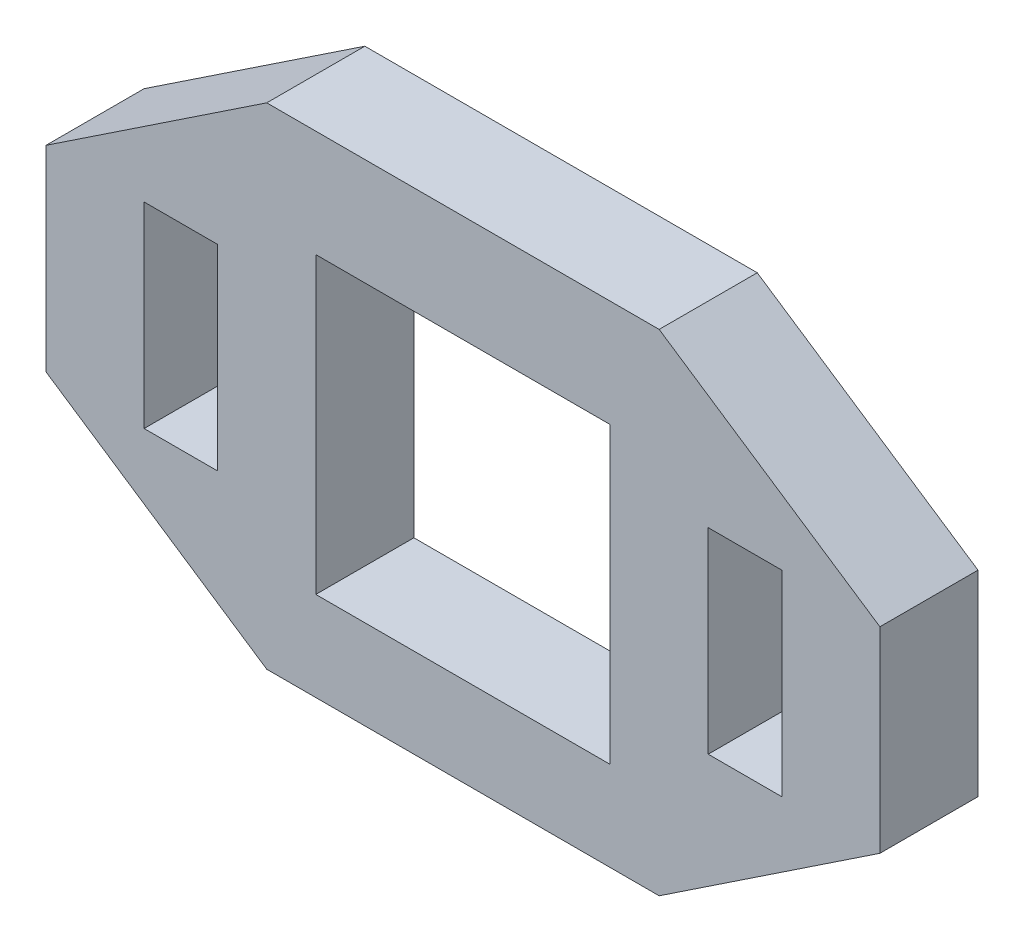
ISO-10303-21;
HEADER;
FILE_DESCRIPTION(('STEP AP214'),'2;1');
FILE_NAME('part.step','',(''),(''),'','','');
FILE_SCHEMA(('AUTOMOTIVE_DESIGN { 1 0 10303 214 1 1 1 1 }'));
ENDSEC;
DATA;
#1=APPLICATION_CONTEXT('core data for automotive mechanical design processes');
#2=APPLICATION_PROTOCOL_DEFINITION('international standard','automotive_design',2000,#1);
#3=PRODUCT_CONTEXT('',#1,'mechanical');
#4=PRODUCT('Part','Part','',(#3));
#5=PRODUCT_RELATED_PRODUCT_CATEGORY('part','',(#4));
#6=PRODUCT_DEFINITION_FORMATION('','',#4);
#7=PRODUCT_DEFINITION_CONTEXT('part definition',#1,'design');
#8=PRODUCT_DEFINITION('design','',#6,#7);
#9=PRODUCT_DEFINITION_SHAPE('','',#8);
#10=(LENGTH_UNIT() NAMED_UNIT(*) SI_UNIT(.MILLI.,.METRE.));
#11=(NAMED_UNIT(*) PLANE_ANGLE_UNIT() SI_UNIT($,.RADIAN.));
#12=(NAMED_UNIT(*) SI_UNIT($,.STERADIAN.) SOLID_ANGLE_UNIT());
#13=UNCERTAINTY_MEASURE_WITH_UNIT(LENGTH_MEASURE(1.E-05),#10,'distance_accuracy_value','');
#14=(GEOMETRIC_REPRESENTATION_CONTEXT(3) GLOBAL_UNCERTAINTY_ASSIGNED_CONTEXT((#13)) GLOBAL_UNIT_ASSIGNED_CONTEXT((#10,
#11,#12)) REPRESENTATION_CONTEXT('',''));
#15=CARTESIAN_POINT('',(0.,0.,0.));
#16=DIRECTION('',(0.,0.,1.));
#17=DIRECTION('',(1.,0.,0.));
#18=AXIS2_PLACEMENT_3D('',#15,#16,#17);
#19=CARTESIAN_POINT('',(0.,0.,25.4));
#20=DIRECTION('',(0.,0.,-1.));
#21=DIRECTION('',(-1.,0.,0.));
#22=AXIS2_PLACEMENT_3D('',#19,#20,#21);
#23=PLANE('',#22);
#24=DIRECTION('',(0.,-1.,0.));
#25=VECTOR('',#24,1.);
#26=CARTESIAN_POINT('',(25.4,0.,25.4));
#27=LINE('',#26,#25);
#28=CARTESIAN_POINT('',(25.4,50.8,25.4));
#29=VERTEX_POINT('',#28);
#30=CARTESIAN_POINT('',(25.4,0.,25.4));
#31=VERTEX_POINT('',#30);
#32=EDGE_CURVE('E225',#29,#31,#27,.T.);
#33=ORIENTED_EDGE('',*,*,#32,.F.);
#34=DIRECTION('',(-1.,0.,0.));
#35=VECTOR('',#34,1.);
#36=CARTESIAN_POINT('',(25.4,50.8,25.4));
#37=LINE('',#36,#35);
#38=CARTESIAN_POINT('',(44.45,50.8,25.4));
#39=VERTEX_POINT('',#38);
#40=EDGE_CURVE('E236',#39,#29,#37,.T.);
#41=ORIENTED_EDGE('',*,*,#40,.F.);
#42=DIRECTION('',(0.,1.,0.));
#43=VECTOR('',#42,1.);
#44=CARTESIAN_POINT('',(44.45,0.,25.4));
#45=LINE('',#44,#43);
#46=CARTESIAN_POINT('',(44.45,0.,25.4));
#47=VERTEX_POINT('',#46);
#48=EDGE_CURVE('E232',#47,#39,#45,.T.);
#49=ORIENTED_EDGE('',*,*,#48,.F.);
#50=DIRECTION('',(1.,0.,0.));
#51=VECTOR('',#50,1.);
#52=CARTESIAN_POINT('',(25.4,0.,25.4));
#53=LINE('',#52,#51);
#54=EDGE_CURVE('E228',#31,#47,#53,.T.);
#55=ORIENTED_EDGE('',*,*,#54,.F.);
#56=EDGE_LOOP('',(#33,#41,#49,#55));
#57=FACE_BOUND('',#56,.T.);
#58=DIRECTION('',(0.832050294337844,-0.554700196225229,0.));
#59=VECTOR('',#58,1.);
#60=CARTESIAN_POINT('',(57.15,-38.1,25.4));
#61=LINE('',#60,#59);
#62=CARTESIAN_POINT('',(0.,0.,25.4));
#63=VERTEX_POINT('',#62);
#64=CARTESIAN_POINT('',(57.15,-38.1,25.4));
#65=VERTEX_POINT('',#64);
#66=EDGE_CURVE('E311',#63,#65,#61,.T.);
#67=ORIENTED_EDGE('',*,*,#66,.T.);
#68=DIRECTION('',(1.,0.,0.));
#69=VECTOR('',#68,1.);
#70=CARTESIAN_POINT('',(158.75,-38.1,25.4));
#71=LINE('',#70,#69);
#72=CARTESIAN_POINT('',(158.75,-38.1,25.4));
#73=VERTEX_POINT('',#72);
#74=EDGE_CURVE('E315',#65,#73,#71,.T.);
#75=ORIENTED_EDGE('',*,*,#74,.T.);
#76=DIRECTION('',(0.832050294337844,0.554700196225229,0.));
#77=VECTOR('',#76,1.);
#78=CARTESIAN_POINT('',(215.9,0.,25.4));
#79=LINE('',#78,#77);
#80=CARTESIAN_POINT('',(215.9,0.,25.4));
#81=VERTEX_POINT('',#80);
#82=EDGE_CURVE('E319',#73,#81,#79,.T.);
#83=ORIENTED_EDGE('',*,*,#82,.T.);
#84=DIRECTION('',(0.,1.,0.));
#85=VECTOR('',#84,1.);
#86=CARTESIAN_POINT('',(215.9,50.8,25.4));
#87=LINE('',#86,#85);
#88=CARTESIAN_POINT('',(215.9,50.8,25.4));
#89=VERTEX_POINT('',#88);
#90=EDGE_CURVE('E322',#81,#89,#87,.T.);
#91=ORIENTED_EDGE('',*,*,#90,.T.);
#92=DIRECTION('',(-0.832050294337844,0.554700196225229,0.));
#93=VECTOR('',#92,1.);
#94=CARTESIAN_POINT('',(158.75,88.9,25.4));
#95=LINE('',#94,#93);
#96=CARTESIAN_POINT('',(158.75,88.9,25.4));
#97=VERTEX_POINT('',#96);
#98=EDGE_CURVE('E325',#89,#97,#95,.T.);
#99=ORIENTED_EDGE('',*,*,#98,.T.);
#100=DIRECTION('',(-1.,0.,0.));
#101=VECTOR('',#100,1.);
#102=CARTESIAN_POINT('',(57.15,88.9,25.4));
#103=LINE('',#102,#101);
#104=CARTESIAN_POINT('',(57.15,88.9,25.4));
#105=VERTEX_POINT('',#104);
#106=EDGE_CURVE('E328',#97,#105,#103,.T.);
#107=ORIENTED_EDGE('',*,*,#106,.T.);
#108=DIRECTION('',(-0.832050294337844,-0.554700196225229,0.));
#109=VECTOR('',#108,1.);
#110=CARTESIAN_POINT('',(0.,50.8,25.4));
#111=LINE('',#110,#109);
#112=CARTESIAN_POINT('',(0.,50.8,25.4));
#113=VERTEX_POINT('',#112);
#114=EDGE_CURVE('E331',#105,#113,#111,.T.);
#115=ORIENTED_EDGE('',*,*,#114,.T.);
#116=DIRECTION('',(0.,-1.,0.));
#117=VECTOR('',#116,1.);
#118=CARTESIAN_POINT('',(0.,0.,25.4));
#119=LINE('',#118,#117);
#120=EDGE_CURVE('E334',#113,#63,#119,.T.);
#121=ORIENTED_EDGE('',*,*,#120,.T.);
#122=EDGE_LOOP('',(#67,#75,#83,#91,#99,#107,#115,#121));
#123=FACE_BOUND('',#122,.T.);
#124=DIRECTION('',(0.,-1.,0.));
#125=VECTOR('',#124,1.);
#126=CARTESIAN_POINT('',(69.85,61.2243588258317,25.4));
#127=LINE('',#126,#125);
#128=CARTESIAN_POINT('',(69.85,61.2243588258317,25.4));
#129=VERTEX_POINT('',#128);
#130=CARTESIAN_POINT('',(69.85,-14.9756411741683,25.4));
#131=VERTEX_POINT('',#130);
#132=EDGE_CURVE('E268',#129,#131,#127,.T.);
#133=ORIENTED_EDGE('',*,*,#132,.F.);
#134=DIRECTION('',(-1.,0.,0.));
#135=VECTOR('',#134,1.);
#136=CARTESIAN_POINT('',(69.85,61.2243588258317,25.4));
#137=LINE('',#136,#135);
#138=CARTESIAN_POINT('',(146.05,61.2243588258317,25.4));
#139=VERTEX_POINT('',#138);
#140=EDGE_CURVE('E279',#139,#129,#137,.T.);
#141=ORIENTED_EDGE('',*,*,#140,.F.);
#142=DIRECTION('',(0.,1.,0.));
#143=VECTOR('',#142,1.);
#144=CARTESIAN_POINT('',(146.05,61.2243588258317,25.4));
#145=LINE('',#144,#143);
#146=CARTESIAN_POINT('',(146.05,-14.9756411741683,25.4));
#147=VERTEX_POINT('',#146);
#148=EDGE_CURVE('E275',#147,#139,#145,.T.);
#149=ORIENTED_EDGE('',*,*,#148,.F.);
#150=DIRECTION('',(1.,0.,0.));
#151=VECTOR('',#150,1.);
#152=CARTESIAN_POINT('',(69.85,-14.9756411741683,25.4));
#153=LINE('',#152,#151);
#154=EDGE_CURVE('E271',#131,#147,#153,.T.);
#155=ORIENTED_EDGE('',*,*,#154,.F.);
#156=EDGE_LOOP('',(#133,#141,#149,#155));
#157=FACE_BOUND('',#156,.T.);
#158=DIRECTION('',(0.,1.,0.));
#159=VECTOR('',#158,1.);
#160=CARTESIAN_POINT('',(190.5,50.8,25.4));
#161=LINE('',#160,#159);
#162=CARTESIAN_POINT('',(190.5,0.,25.4));
#163=VERTEX_POINT('',#162);
#164=CARTESIAN_POINT('',(190.5,50.8,25.4));
#165=VERTEX_POINT('',#164);
#166=EDGE_CURVE('E177',#163,#165,#161,.T.);
#167=ORIENTED_EDGE('',*,*,#166,.F.);
#168=DIRECTION('',(1.,0.,0.));
#169=VECTOR('',#168,1.);
#170=CARTESIAN_POINT('',(190.5,0.,25.4));
#171=LINE('',#170,#169);
#172=CARTESIAN_POINT('',(171.45,0.,25.4));
#173=VERTEX_POINT('',#172);
#174=EDGE_CURVE('E203',#173,#163,#171,.T.);
#175=ORIENTED_EDGE('',*,*,#174,.F.);
#176=DIRECTION('',(0.,-1.,0.));
#177=VECTOR('',#176,1.);
#178=CARTESIAN_POINT('',(171.45,50.8,25.4));
#179=LINE('',#178,#177);
#180=CARTESIAN_POINT('',(171.45,50.8,25.4));
#181=VERTEX_POINT('',#180);
#182=EDGE_CURVE('E199',#181,#173,#179,.T.);
#183=ORIENTED_EDGE('',*,*,#182,.F.);
#184=DIRECTION('',(-1.,0.,0.));
#185=VECTOR('',#184,1.);
#186=CARTESIAN_POINT('',(190.5,50.8,25.4));
#187=LINE('',#186,#185);
#188=EDGE_CURVE('E186',#165,#181,#187,.T.);
#189=ORIENTED_EDGE('',*,*,#188,.F.);
#190=EDGE_LOOP('',(#167,#175,#183,#189));
#191=FACE_BOUND('',#190,.T.);
#192=ADVANCED_FACE('F39',(#57,#123,#157,#191),#23,.F.);
#193=CARTESIAN_POINT('',(0.,0.,0.));
#194=DIRECTION('',(0.,0.,-1.));
#195=DIRECTION('',(-1.,0.,0.));
#196=AXIS2_PLACEMENT_3D('',#193,#194,#195);
#197=PLANE('',#196);
#198=DIRECTION('',(0.832050294337844,-0.554700196225229,0.));
#199=VECTOR('',#198,1.);
#200=CARTESIAN_POINT('',(57.15,-38.1,0.));
#201=LINE('',#200,#199);
#202=CARTESIAN_POINT('',(0.,0.,0.));
#203=VERTEX_POINT('',#202);
#204=CARTESIAN_POINT('',(57.15,-38.1,0.));
#205=VERTEX_POINT('',#204);
#206=EDGE_CURVE('E310',#203,#205,#201,.T.);
#207=ORIENTED_EDGE('',*,*,#206,.F.);
#208=DIRECTION('',(0.,-1.,0.));
#209=VECTOR('',#208,1.);
#210=CARTESIAN_POINT('',(0.,0.,0.));
#211=LINE('',#210,#209);
#212=CARTESIAN_POINT('',(0.,50.8,0.));
#213=VERTEX_POINT('',#212);
#214=EDGE_CURVE('E316',#213,#203,#211,.T.);
#215=ORIENTED_EDGE('',*,*,#214,.F.);
#216=DIRECTION('',(-0.832050294337844,-0.554700196225229,0.));
#217=VECTOR('',#216,1.);
#218=CARTESIAN_POINT('',(0.,50.8,0.));
#219=LINE('',#218,#217);
#220=CARTESIAN_POINT('',(57.15,88.9,0.));
#221=VERTEX_POINT('',#220);
#222=EDGE_CURVE('E356',#221,#213,#219,.T.);
#223=ORIENTED_EDGE('',*,*,#222,.F.);
#224=DIRECTION('',(-1.,0.,0.));
#225=VECTOR('',#224,1.);
#226=CARTESIAN_POINT('',(57.15,88.9,0.));
#227=LINE('',#226,#225);
#228=CARTESIAN_POINT('',(158.75,88.9,0.));
#229=VERTEX_POINT('',#228);
#230=EDGE_CURVE('E353',#229,#221,#227,.T.);
#231=ORIENTED_EDGE('',*,*,#230,.F.);
#232=DIRECTION('',(-0.832050294337844,0.554700196225229,0.));
#233=VECTOR('',#232,1.);
#234=CARTESIAN_POINT('',(158.75,88.9,0.));
#235=LINE('',#234,#233);
#236=CARTESIAN_POINT('',(215.9,50.8,0.));
#237=VERTEX_POINT('',#236);
#238=EDGE_CURVE('E350',#237,#229,#235,.T.);
#239=ORIENTED_EDGE('',*,*,#238,.F.);
#240=DIRECTION('',(0.,1.,0.));
#241=VECTOR('',#240,1.);
#242=CARTESIAN_POINT('',(215.9,50.8,0.));
#243=LINE('',#242,#241);
#244=CARTESIAN_POINT('',(215.9,0.,0.));
#245=VERTEX_POINT('',#244);
#246=EDGE_CURVE('E347',#245,#237,#243,.T.);
#247=ORIENTED_EDGE('',*,*,#246,.F.);
#248=DIRECTION('',(0.832050294337844,0.554700196225229,0.));
#249=VECTOR('',#248,1.);
#250=CARTESIAN_POINT('',(215.9,0.,0.));
#251=LINE('',#250,#249);
#252=CARTESIAN_POINT('',(158.75,-38.1,0.));
#253=VERTEX_POINT('',#252);
#254=EDGE_CURVE('E344',#253,#245,#251,.T.);
#255=ORIENTED_EDGE('',*,*,#254,.F.);
#256=DIRECTION('',(1.,0.,0.));
#257=VECTOR('',#256,1.);
#258=CARTESIAN_POINT('',(158.75,-38.1,0.));
#259=LINE('',#258,#257);
#260=EDGE_CURVE('E341',#205,#253,#259,.T.);
#261=ORIENTED_EDGE('',*,*,#260,.F.);
#262=EDGE_LOOP('',(#207,#215,#223,#231,#239,#247,#255,#261));
#263=FACE_BOUND('',#262,.T.);
#264=DIRECTION('',(-1.,0.,0.));
#265=VECTOR('',#264,1.);
#266=CARTESIAN_POINT('',(69.85,61.2243588258317,0.));
#267=LINE('',#266,#265);
#268=CARTESIAN_POINT('',(146.05,61.2243588258317,0.));
#269=VERTEX_POINT('',#268);
#270=CARTESIAN_POINT('',(69.85,61.2243588258317,0.));
#271=VERTEX_POINT('',#270);
#272=EDGE_CURVE('E272',#269,#271,#267,.T.);
#273=ORIENTED_EDGE('',*,*,#272,.T.);
#274=DIRECTION('',(0.,-1.,0.));
#275=VECTOR('',#274,1.);
#276=CARTESIAN_POINT('',(69.85,61.2243588258317,0.));
#277=LINE('',#276,#275);
#278=CARTESIAN_POINT('',(69.85,-14.9756411741683,0.));
#279=VERTEX_POINT('',#278);
#280=EDGE_CURVE('E267',#271,#279,#277,.T.);
#281=ORIENTED_EDGE('',*,*,#280,.T.);
#282=DIRECTION('',(1.,0.,0.));
#283=VECTOR('',#282,1.);
#284=CARTESIAN_POINT('',(69.85,-14.9756411741683,0.));
#285=LINE('',#284,#283);
#286=CARTESIAN_POINT('',(146.05,-14.9756411741683,0.));
#287=VERTEX_POINT('',#286);
#288=EDGE_CURVE('E286',#279,#287,#285,.T.);
#289=ORIENTED_EDGE('',*,*,#288,.T.);
#290=DIRECTION('',(0.,1.,0.));
#291=VECTOR('',#290,1.);
#292=CARTESIAN_POINT('',(146.05,61.2243588258317,0.));
#293=LINE('',#292,#291);
#294=EDGE_CURVE('E290',#287,#269,#293,.T.);
#295=ORIENTED_EDGE('',*,*,#294,.T.);
#296=EDGE_LOOP('',(#273,#281,#289,#295));
#297=FACE_BOUND('',#296,.T.);
#298=DIRECTION('',(-1.,0.,0.));
#299=VECTOR('',#298,1.);
#300=CARTESIAN_POINT('',(25.4,50.8,0.));
#301=LINE('',#300,#299);
#302=CARTESIAN_POINT('',(44.45,50.8,0.));
#303=VERTEX_POINT('',#302);
#304=CARTESIAN_POINT('',(25.4,50.8,0.));
#305=VERTEX_POINT('',#304);
#306=EDGE_CURVE('E229',#303,#305,#301,.T.);
#307=ORIENTED_EDGE('',*,*,#306,.T.);
#308=DIRECTION('',(0.,-1.,0.));
#309=VECTOR('',#308,1.);
#310=CARTESIAN_POINT('',(25.4,0.,0.));
#311=LINE('',#310,#309);
#312=CARTESIAN_POINT('',(25.4,0.,0.));
#313=VERTEX_POINT('',#312);
#314=EDGE_CURVE('E195',#305,#313,#311,.T.);
#315=ORIENTED_EDGE('',*,*,#314,.T.);
#316=DIRECTION('',(1.,0.,0.));
#317=VECTOR('',#316,1.);
#318=CARTESIAN_POINT('',(25.4,0.,0.));
#319=LINE('',#318,#317);
#320=CARTESIAN_POINT('',(44.45,0.,0.));
#321=VERTEX_POINT('',#320);
#322=EDGE_CURVE('E243',#313,#321,#319,.T.);
#323=ORIENTED_EDGE('',*,*,#322,.T.);
#324=DIRECTION('',(0.,1.,0.));
#325=VECTOR('',#324,1.);
#326=CARTESIAN_POINT('',(44.45,0.,0.));
#327=LINE('',#326,#325);
#328=EDGE_CURVE('E247',#321,#303,#327,.T.);
#329=ORIENTED_EDGE('',*,*,#328,.T.);
#330=EDGE_LOOP('',(#307,#315,#323,#329));
#331=FACE_BOUND('',#330,.T.);
#332=DIRECTION('',(1.,0.,0.));
#333=VECTOR('',#332,1.);
#334=CARTESIAN_POINT('',(190.5,0.,0.));
#335=LINE('',#334,#333);
#336=CARTESIAN_POINT('',(171.45,0.,0.));
#337=VERTEX_POINT('',#336);
#338=CARTESIAN_POINT('',(190.5,0.,0.));
#339=VERTEX_POINT('',#338);
#340=EDGE_CURVE('E187',#337,#339,#335,.T.);
#341=ORIENTED_EDGE('',*,*,#340,.T.);
#342=DIRECTION('',(0.,1.,0.));
#343=VECTOR('',#342,1.);
#344=CARTESIAN_POINT('',(190.5,50.8,0.));
#345=LINE('',#344,#343);
#346=CARTESIAN_POINT('',(190.5,50.8,0.));
#347=VERTEX_POINT('',#346);
#348=EDGE_CURVE('E63',#339,#347,#345,.T.);
#349=ORIENTED_EDGE('',*,*,#348,.T.);
#350=DIRECTION('',(-1.,0.,0.));
#351=VECTOR('',#350,1.);
#352=CARTESIAN_POINT('',(190.5,50.8,0.));
#353=LINE('',#352,#351);
#354=CARTESIAN_POINT('',(171.45,50.8,0.));
#355=VERTEX_POINT('',#354);
#356=EDGE_CURVE('E193',#347,#355,#353,.T.);
#357=ORIENTED_EDGE('',*,*,#356,.T.);
#358=DIRECTION('',(0.,-1.,0.));
#359=VECTOR('',#358,1.);
#360=CARTESIAN_POINT('',(171.45,50.8,0.));
#361=LINE('',#360,#359);
#362=EDGE_CURVE('E212',#355,#337,#361,.T.);
#363=ORIENTED_EDGE('',*,*,#362,.T.);
#364=EDGE_LOOP('',(#341,#349,#357,#363));
#365=FACE_BOUND('',#364,.T.);
#366=ADVANCED_FACE('F395',(#263,#297,#331,#365),#197,.T.);
#367=CARTESIAN_POINT('',(57.15,-38.1,25.4));
#368=DIRECTION('',(0.554700196225229,0.832050294337844,0.));
#369=DIRECTION('',(-0.832050294337844,0.554700196225229,0.));
#370=AXIS2_PLACEMENT_3D('',#367,#368,#369);
#371=PLANE('',#370);
#372=ORIENTED_EDGE('',*,*,#206,.T.);
#373=DIRECTION('',(0.,0.,-1.));
#374=VECTOR('',#373,1.);
#375=CARTESIAN_POINT('',(57.15,-38.1,25.4));
#376=LINE('',#375,#374);
#377=EDGE_CURVE('E11',#65,#205,#376,.T.);
#378=ORIENTED_EDGE('',*,*,#377,.F.);
#379=ORIENTED_EDGE('',*,*,#66,.F.);
#380=DIRECTION('',(0.,0.,-1.));
#381=VECTOR('',#380,1.);
#382=CARTESIAN_POINT('',(0.,0.,25.4));
#383=LINE('',#382,#381);
#384=EDGE_CURVE('E337',#63,#203,#383,.T.);
#385=ORIENTED_EDGE('',*,*,#384,.T.);
#386=EDGE_LOOP('',(#372,#378,#379,#385));
#387=FACE_BOUND('',#386,.T.);
#388=ADVANCED_FACE('F41',(#387),#371,.F.);
#389=CARTESIAN_POINT('',(158.75,-38.1,25.4));
#390=DIRECTION('',(0.,1.,0.));
#391=DIRECTION('',(-1.,0.,0.));
#392=AXIS2_PLACEMENT_3D('',#389,#390,#391);
#393=PLANE('',#392);
#394=ORIENTED_EDGE('',*,*,#260,.T.);
#395=DIRECTION('',(0.,0.,-1.));
#396=VECTOR('',#395,1.);
#397=CARTESIAN_POINT('',(158.75,-38.1,25.4));
#398=LINE('',#397,#396);
#399=EDGE_CURVE('E48',#73,#253,#398,.T.);
#400=ORIENTED_EDGE('',*,*,#399,.F.);
#401=ORIENTED_EDGE('',*,*,#74,.F.);
#402=ORIENTED_EDGE('',*,*,#377,.T.);
#403=EDGE_LOOP('',(#394,#400,#401,#402));
#404=FACE_BOUND('',#403,.T.);
#405=ADVANCED_FACE('F413',(#404),#393,.F.);
#406=CARTESIAN_POINT('',(215.9,0.,25.4));
#407=DIRECTION('',(-0.554700196225229,0.832050294337844,0.));
#408=DIRECTION('',(-0.832050294337844,-0.554700196225229,0.));
#409=AXIS2_PLACEMENT_3D('',#406,#407,#408);
#410=PLANE('',#409);
#411=ORIENTED_EDGE('',*,*,#254,.T.);
#412=DIRECTION('',(0.,0.,-1.));
#413=VECTOR('',#412,1.);
#414=CARTESIAN_POINT('',(215.9,0.,25.4));
#415=LINE('',#414,#413);
#416=EDGE_CURVE('E380',#81,#245,#415,.T.);
#417=ORIENTED_EDGE('',*,*,#416,.F.);
#418=ORIENTED_EDGE('',*,*,#82,.F.);
#419=ORIENTED_EDGE('',*,*,#399,.T.);
#420=EDGE_LOOP('',(#411,#417,#418,#419));
#421=FACE_BOUND('',#420,.T.);
#422=ADVANCED_FACE('F389',(#421),#410,.F.);
#423=CARTESIAN_POINT('',(215.9,50.8,25.4));
#424=DIRECTION('',(-1.,0.,0.));
#425=DIRECTION('',(0.,0.,1.));
#426=AXIS2_PLACEMENT_3D('',#423,#424,#425);
#427=PLANE('',#426);
#428=ORIENTED_EDGE('',*,*,#246,.T.);
#429=DIRECTION('',(0.,0.,-1.));
#430=VECTOR('',#429,1.);
#431=CARTESIAN_POINT('',(215.9,50.8,25.4));
#432=LINE('',#431,#430);
#433=EDGE_CURVE('E376',#89,#237,#432,.T.);
#434=ORIENTED_EDGE('',*,*,#433,.F.);
#435=ORIENTED_EDGE('',*,*,#90,.F.);
#436=ORIENTED_EDGE('',*,*,#416,.T.);
#437=EDGE_LOOP('',(#428,#434,#435,#436));
#438=FACE_BOUND('',#437,.T.);
#439=ADVANCED_FACE('F401',(#438),#427,.F.);
#440=CARTESIAN_POINT('',(158.75,88.9,25.4));
#441=DIRECTION('',(-0.554700196225229,-0.832050294337844,0.));
#442=DIRECTION('',(0.832050294337844,-0.554700196225229,0.));
#443=AXIS2_PLACEMENT_3D('',#440,#441,#442);
#444=PLANE('',#443);
#445=ORIENTED_EDGE('',*,*,#238,.T.);
#446=DIRECTION('',(0.,0.,-1.));
#447=VECTOR('',#446,1.);
#448=CARTESIAN_POINT('',(158.75,88.9,25.4));
#449=LINE('',#448,#447);
#450=EDGE_CURVE('E372',#97,#229,#449,.T.);
#451=ORIENTED_EDGE('',*,*,#450,.F.);
#452=ORIENTED_EDGE('',*,*,#98,.F.);
#453=ORIENTED_EDGE('',*,*,#433,.T.);
#454=EDGE_LOOP('',(#445,#451,#452,#453));
#455=FACE_BOUND('',#454,.T.);
#456=ADVANCED_FACE('F405',(#455),#444,.F.);
#457=CARTESIAN_POINT('',(57.15,88.9,25.4));
#458=DIRECTION('',(0.,-1.,0.));
#459=DIRECTION('',(0.,0.,-1.));
#460=AXIS2_PLACEMENT_3D('',#457,#458,#459);
#461=PLANE('',#460);
#462=ORIENTED_EDGE('',*,*,#230,.T.);
#463=DIRECTION('',(0.,0.,-1.));
#464=VECTOR('',#463,1.);
#465=CARTESIAN_POINT('',(57.15,88.9,25.4));
#466=LINE('',#465,#464);
#467=EDGE_CURVE('E368',#105,#221,#466,.T.);
#468=ORIENTED_EDGE('',*,*,#467,.F.);
#469=ORIENTED_EDGE('',*,*,#106,.F.);
#470=ORIENTED_EDGE('',*,*,#450,.T.);
#471=EDGE_LOOP('',(#462,#468,#469,#470));
#472=FACE_BOUND('',#471,.T.);
#473=ADVANCED_FACE('F426',(#472),#461,.F.);
#474=CARTESIAN_POINT('',(0.,50.8,25.4));
#475=DIRECTION('',(0.554700196225229,-0.832050294337843,0.));
#476=DIRECTION('',(0.832050294337844,0.554700196225229,0.));
#477=AXIS2_PLACEMENT_3D('',#474,#475,#476);
#478=PLANE('',#477);
#479=ORIENTED_EDGE('',*,*,#222,.T.);
#480=DIRECTION('',(0.,0.,-1.));
#481=VECTOR('',#480,1.);
#482=CARTESIAN_POINT('',(0.,50.8,25.4));
#483=LINE('',#482,#481);
#484=EDGE_CURVE('E364',#113,#213,#483,.T.);
#485=ORIENTED_EDGE('',*,*,#484,.F.);
#486=ORIENTED_EDGE('',*,*,#114,.F.);
#487=ORIENTED_EDGE('',*,*,#467,.T.);
#488=EDGE_LOOP('',(#479,#485,#486,#487));
#489=FACE_BOUND('',#488,.T.);
#490=ADVANCED_FACE('F424',(#489),#478,.F.);
#491=CARTESIAN_POINT('',(0.,0.,25.4));
#492=DIRECTION('',(1.,0.,0.));
#493=DIRECTION('',(0.,0.,-1.));
#494=AXIS2_PLACEMENT_3D('',#491,#492,#493);
#495=PLANE('',#494);
#496=ORIENTED_EDGE('',*,*,#214,.T.);
#497=ORIENTED_EDGE('',*,*,#384,.F.);
#498=ORIENTED_EDGE('',*,*,#120,.F.);
#499=ORIENTED_EDGE('',*,*,#484,.T.);
#500=EDGE_LOOP('',(#496,#497,#498,#499));
#501=FACE_BOUND('',#500,.T.);
#502=ADVANCED_FACE('F419',(#501),#495,.F.);
#503=CARTESIAN_POINT('',(69.85,61.2243588258317,25.4));
#504=DIRECTION('',(1.,0.,0.));
#505=DIRECTION('',(0.,1.,0.));
#506=AXIS2_PLACEMENT_3D('',#503,#504,#505);
#507=PLANE('',#506);
#508=ORIENTED_EDGE('',*,*,#280,.F.);
#509=DIRECTION('',(0.,0.,-1.));
#510=VECTOR('',#509,1.);
#511=CARTESIAN_POINT('',(69.85,61.2243588258317,25.4));
#512=LINE('',#511,#510);
#513=EDGE_CURVE('E282',#129,#271,#512,.T.);
#514=ORIENTED_EDGE('',*,*,#513,.F.);
#515=ORIENTED_EDGE('',*,*,#132,.T.);
#516=DIRECTION('',(0.,0.,-1.));
#517=VECTOR('',#516,1.);
#518=CARTESIAN_POINT('',(69.85,-14.9756411741683,25.4));
#519=LINE('',#518,#517);
#520=EDGE_CURVE('E306',#131,#279,#519,.T.);
#521=ORIENTED_EDGE('',*,*,#520,.T.);
#522=EDGE_LOOP('',(#508,#514,#515,#521));
#523=FACE_BOUND('',#522,.T.);
#524=ADVANCED_FACE('F444',(#523),#507,.T.);
#525=CARTESIAN_POINT('',(69.85,-14.9756411741683,25.4));
#526=DIRECTION('',(0.,1.,0.));
#527=DIRECTION('',(0.,0.,1.));
#528=AXIS2_PLACEMENT_3D('',#525,#526,#527);
#529=PLANE('',#528);
#530=ORIENTED_EDGE('',*,*,#288,.F.);
#531=ORIENTED_EDGE('',*,*,#520,.F.);
#532=ORIENTED_EDGE('',*,*,#154,.T.);
#533=DIRECTION('',(0.,0.,-1.));
#534=VECTOR('',#533,1.);
#535=CARTESIAN_POINT('',(146.05,-14.9756411741683,25.4));
#536=LINE('',#535,#534);
#537=EDGE_CURVE('E303',#147,#287,#536,.T.);
#538=ORIENTED_EDGE('',*,*,#537,.T.);
#539=EDGE_LOOP('',(#530,#531,#532,#538));
#540=FACE_BOUND('',#539,.T.);
#541=ADVANCED_FACE('F451',(#540),#529,.T.);
#542=CARTESIAN_POINT('',(146.05,61.2243588258317,25.4));
#543=DIRECTION('',(-1.,0.,0.));
#544=DIRECTION('',(0.,0.,1.));
#545=AXIS2_PLACEMENT_3D('',#542,#543,#544);
#546=PLANE('',#545);
#547=ORIENTED_EDGE('',*,*,#294,.F.);
#548=ORIENTED_EDGE('',*,*,#537,.F.);
#549=ORIENTED_EDGE('',*,*,#148,.T.);
#550=DIRECTION('',(0.,0.,-1.));
#551=VECTOR('',#550,1.);
#552=CARTESIAN_POINT('',(146.05,61.2243588258317,25.4));
#553=LINE('',#552,#551);
#554=EDGE_CURVE('E300',#139,#269,#553,.T.);
#555=ORIENTED_EDGE('',*,*,#554,.T.);
#556=EDGE_LOOP('',(#547,#548,#549,#555));
#557=FACE_BOUND('',#556,.T.);
#558=ADVANCED_FACE('F456',(#557),#546,.T.);
#559=CARTESIAN_POINT('',(69.85,61.2243588258317,25.4));
#560=DIRECTION('',(0.,-1.,0.));
#561=DIRECTION('',(0.,0.,-1.));
#562=AXIS2_PLACEMENT_3D('',#559,#560,#561);
#563=PLANE('',#562);
#564=ORIENTED_EDGE('',*,*,#272,.F.);
#565=ORIENTED_EDGE('',*,*,#554,.F.);
#566=ORIENTED_EDGE('',*,*,#140,.T.);
#567=ORIENTED_EDGE('',*,*,#513,.T.);
#568=EDGE_LOOP('',(#564,#565,#566,#567));
#569=FACE_BOUND('',#568,.T.);
#570=ADVANCED_FACE('F463',(#569),#563,.T.);
#571=CARTESIAN_POINT('',(25.4,0.,25.4));
#572=DIRECTION('',(1.,0.,0.));
#573=DIRECTION('',(0.,0.,-1.));
#574=AXIS2_PLACEMENT_3D('',#571,#572,#573);
#575=PLANE('',#574);
#576=ORIENTED_EDGE('',*,*,#314,.F.);
#577=DIRECTION('',(0.,0.,-1.));
#578=VECTOR('',#577,1.);
#579=CARTESIAN_POINT('',(25.4,50.8,25.4));
#580=LINE('',#579,#578);
#581=EDGE_CURVE('E239',#29,#305,#580,.T.);
#582=ORIENTED_EDGE('',*,*,#581,.F.);
#583=ORIENTED_EDGE('',*,*,#32,.T.);
#584=DIRECTION('',(0.,0.,-1.));
#585=VECTOR('',#584,1.);
#586=CARTESIAN_POINT('',(25.4,0.,25.4));
#587=LINE('',#586,#585);
#588=EDGE_CURVE('E263',#31,#313,#587,.T.);
#589=ORIENTED_EDGE('',*,*,#588,.T.);
#590=EDGE_LOOP('',(#576,#582,#583,#589));
#591=FACE_BOUND('',#590,.T.);
#592=ADVANCED_FACE('F476',(#591),#575,.T.);
#593=CARTESIAN_POINT('',(25.4,0.,25.4));
#594=DIRECTION('',(0.,1.,0.));
#595=DIRECTION('',(0.,0.,1.));
#596=AXIS2_PLACEMENT_3D('',#593,#594,#595);
#597=PLANE('',#596);
#598=ORIENTED_EDGE('',*,*,#322,.F.);
#599=ORIENTED_EDGE('',*,*,#588,.F.);
#600=ORIENTED_EDGE('',*,*,#54,.T.);
#601=DIRECTION('',(0.,0.,-1.));
#602=VECTOR('',#601,1.);
#603=CARTESIAN_POINT('',(44.45,0.,25.4));
#604=LINE('',#603,#602);
#605=EDGE_CURVE('E260',#47,#321,#604,.T.);
#606=ORIENTED_EDGE('',*,*,#605,.T.);
#607=EDGE_LOOP('',(#598,#599,#600,#606));
#608=FACE_BOUND('',#607,.T.);
#609=ADVANCED_FACE('F481',(#608),#597,.T.);
#610=CARTESIAN_POINT('',(44.45,0.,25.4));
#611=DIRECTION('',(-1.,0.,0.));
#612=DIRECTION('',(0.,0.,1.));
#613=AXIS2_PLACEMENT_3D('',#610,#611,#612);
#614=PLANE('',#613);
#615=ORIENTED_EDGE('',*,*,#328,.F.);
#616=ORIENTED_EDGE('',*,*,#605,.F.);
#617=ORIENTED_EDGE('',*,*,#48,.T.);
#618=DIRECTION('',(0.,0.,-1.));
#619=VECTOR('',#618,1.);
#620=CARTESIAN_POINT('',(44.45,50.8,25.4));
#621=LINE('',#620,#619);
#622=EDGE_CURVE('E257',#39,#303,#621,.T.);
#623=ORIENTED_EDGE('',*,*,#622,.T.);
#624=EDGE_LOOP('',(#615,#616,#617,#623));
#625=FACE_BOUND('',#624,.T.);
#626=ADVANCED_FACE('F485',(#625),#614,.T.);
#627=CARTESIAN_POINT('',(25.4,50.8,25.4));
#628=DIRECTION('',(0.,-1.,0.));
#629=DIRECTION('',(0.,0.,-1.));
#630=AXIS2_PLACEMENT_3D('',#627,#628,#629);
#631=PLANE('',#630);
#632=ORIENTED_EDGE('',*,*,#306,.F.);
#633=ORIENTED_EDGE('',*,*,#622,.F.);
#634=ORIENTED_EDGE('',*,*,#40,.T.);
#635=ORIENTED_EDGE('',*,*,#581,.T.);
#636=EDGE_LOOP('',(#632,#633,#634,#635));
#637=FACE_BOUND('',#636,.T.);
#638=ADVANCED_FACE('F489',(#637),#631,.T.);
#639=CARTESIAN_POINT('',(190.5,50.8,25.4));
#640=DIRECTION('',(-1.,0.,0.));
#641=DIRECTION('',(0.,0.,1.));
#642=AXIS2_PLACEMENT_3D('',#639,#640,#641);
#643=PLANE('',#642);
#644=ORIENTED_EDGE('',*,*,#348,.F.);
#645=DIRECTION('',(0.,0.,-1.));
#646=VECTOR('',#645,1.);
#647=CARTESIAN_POINT('',(190.5,0.,25.4));
#648=LINE('',#647,#646);
#649=EDGE_CURVE('E181',#163,#339,#648,.T.);
#650=ORIENTED_EDGE('',*,*,#649,.F.);
#651=ORIENTED_EDGE('',*,*,#166,.T.);
#652=DIRECTION('',(0.,0.,-1.));
#653=VECTOR('',#652,1.);
#654=CARTESIAN_POINT('',(190.5,50.8,25.4));
#655=LINE('',#654,#653);
#656=EDGE_CURVE('E180',#165,#347,#655,.T.);
#657=ORIENTED_EDGE('',*,*,#656,.T.);
#658=EDGE_LOOP('',(#644,#650,#651,#657));
#659=FACE_BOUND('',#658,.T.);
#660=ADVANCED_FACE('F179',(#659),#643,.T.);
#661=CARTESIAN_POINT('',(190.5,50.8,25.4));
#662=DIRECTION('',(0.,-1.,0.));
#663=DIRECTION('',(1.,0.,0.));
#664=AXIS2_PLACEMENT_3D('',#661,#662,#663);
#665=PLANE('',#664);
#666=ORIENTED_EDGE('',*,*,#356,.F.);
#667=ORIENTED_EDGE('',*,*,#656,.F.);
#668=ORIENTED_EDGE('',*,*,#188,.T.);
#669=DIRECTION('',(0.,0.,-1.));
#670=VECTOR('',#669,1.);
#671=CARTESIAN_POINT('',(171.45,50.8,25.4));
#672=LINE('',#671,#670);
#673=EDGE_CURVE('E196',#181,#355,#672,.T.);
#674=ORIENTED_EDGE('',*,*,#673,.T.);
#675=EDGE_LOOP('',(#666,#667,#668,#674));
#676=FACE_BOUND('',#675,.T.);
#677=ADVANCED_FACE('F190',(#676),#665,.T.);
#678=CARTESIAN_POINT('',(171.45,50.8,25.4));
#679=DIRECTION('',(1.,0.,0.));
#680=DIRECTION('',(0.,0.,-1.));
#681=AXIS2_PLACEMENT_3D('',#678,#679,#680);
#682=PLANE('',#681);
#683=ORIENTED_EDGE('',*,*,#362,.F.);
#684=ORIENTED_EDGE('',*,*,#673,.F.);
#685=ORIENTED_EDGE('',*,*,#182,.T.);
#686=DIRECTION('',(0.,0.,-1.));
#687=VECTOR('',#686,1.);
#688=CARTESIAN_POINT('',(171.45,0.,25.4));
#689=LINE('',#688,#687);
#690=EDGE_CURVE('E55',#173,#337,#689,.T.);
#691=ORIENTED_EDGE('',*,*,#690,.T.);
#692=EDGE_LOOP('',(#683,#684,#685,#691));
#693=FACE_BOUND('',#692,.T.);
#694=ADVANCED_FACE('F498',(#693),#682,.T.);
#695=CARTESIAN_POINT('',(190.5,0.,25.4));
#696=DIRECTION('',(0.,1.,0.));
#697=DIRECTION('',(-1.,0.,0.));
#698=AXIS2_PLACEMENT_3D('',#695,#696,#697);
#699=PLANE('',#698);
#700=ORIENTED_EDGE('',*,*,#340,.F.);
#701=ORIENTED_EDGE('',*,*,#690,.F.);
#702=ORIENTED_EDGE('',*,*,#174,.T.);
#703=ORIENTED_EDGE('',*,*,#649,.T.);
#704=EDGE_LOOP('',(#700,#701,#702,#703));
#705=FACE_BOUND('',#704,.T.);
#706=ADVANCED_FACE('F501',(#705),#699,.T.);
#707=CLOSED_SHELL('',(#192,#366,#388,#405,#422,#439,#456,#473,#490,#502,#524,#541,#558,#570,
#592,#609,#626,#638,#660,#677,#694,#706));
#708=MANIFOLD_SOLID_BREP('B2',#707);
#709=ADVANCED_BREP_SHAPE_REPRESENTATION('',(#18,#708),#14);
#710=SHAPE_DEFINITION_REPRESENTATION(#9,#709);
ENDSEC;
END-ISO-10303-21;
